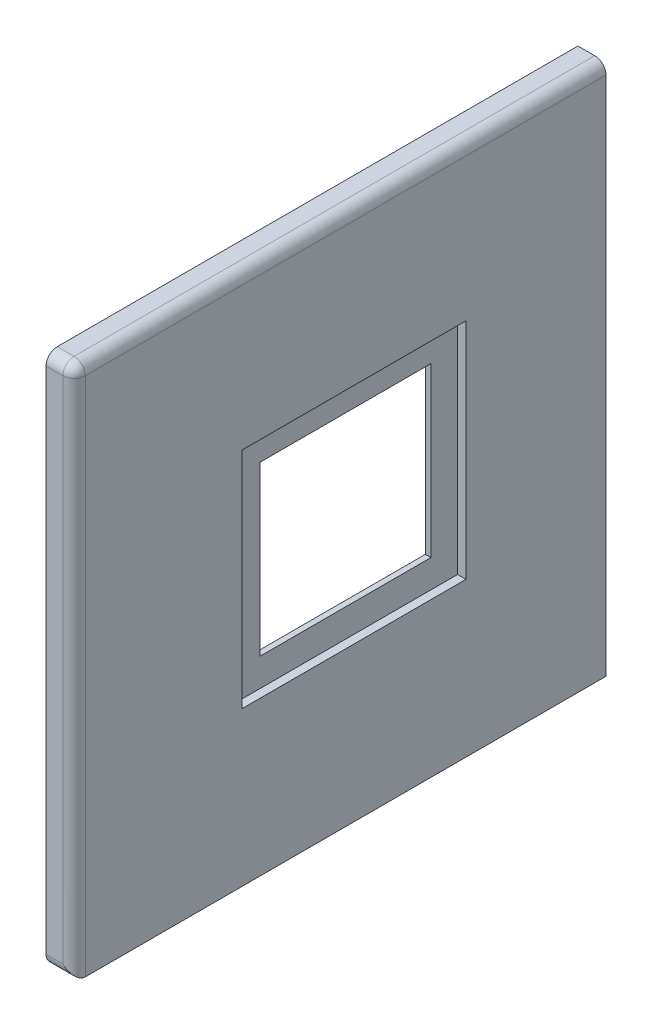
ISO-10303-21;
HEADER;
FILE_DESCRIPTION(('STEP AP214'),'2;1');
FILE_NAME('part.step','',(''),(''),'','','');
FILE_SCHEMA(('AUTOMOTIVE_DESIGN { 1 0 10303 214 1 1 1 1 }'));
ENDSEC;
DATA;
#1=APPLICATION_CONTEXT('core data for automotive mechanical design processes');
#2=APPLICATION_PROTOCOL_DEFINITION('international standard','automotive_design',2000,#1);
#3=PRODUCT_CONTEXT('',#1,'mechanical');
#4=PRODUCT('Part','Part','',(#3));
#5=PRODUCT_RELATED_PRODUCT_CATEGORY('part','',(#4));
#6=PRODUCT_DEFINITION_FORMATION('','',#4);
#7=PRODUCT_DEFINITION_CONTEXT('part definition',#1,'design');
#8=PRODUCT_DEFINITION('design','',#6,#7);
#9=PRODUCT_DEFINITION_SHAPE('','',#8);
#10=(LENGTH_UNIT() NAMED_UNIT(*) SI_UNIT(.MILLI.,.METRE.));
#11=(NAMED_UNIT(*) PLANE_ANGLE_UNIT() SI_UNIT($,.RADIAN.));
#12=(NAMED_UNIT(*) SI_UNIT($,.STERADIAN.) SOLID_ANGLE_UNIT());
#13=UNCERTAINTY_MEASURE_WITH_UNIT(LENGTH_MEASURE(1.E-05),#10,'distance_accuracy_value','');
#14=(GEOMETRIC_REPRESENTATION_CONTEXT(3) GLOBAL_UNCERTAINTY_ASSIGNED_CONTEXT((#13)) GLOBAL_UNIT_ASSIGNED_CONTEXT((#10,
#11,#12)) REPRESENTATION_CONTEXT('',''));
#15=CARTESIAN_POINT('',(0.,0.,0.));
#16=DIRECTION('',(0.,0.,1.));
#17=DIRECTION('',(1.,0.,0.));
#18=AXIS2_PLACEMENT_3D('',#15,#16,#17);
#19=CARTESIAN_POINT('',(5.,36.5,0.));
#20=DIRECTION('',(0.,-1.,0.));
#21=DIRECTION('',(0.,0.,-1.));
#22=AXIS2_PLACEMENT_3D('',#19,#20,#21);
#23=PLANE('',#22);
#24=DIRECTION('',(-1.,0.,0.));
#25=VECTOR('',#24,1.);
#26=CARTESIAN_POINT('',(5.,36.5,36.5));
#27=LINE('',#26,#25);
#28=CARTESIAN_POINT('',(5.,36.5,36.5));
#29=VERTEX_POINT('',#28);
#30=CARTESIAN_POINT('',(2.,36.5,36.5));
#31=VERTEX_POINT('',#30);
#32=EDGE_CURVE('E472',#29,#31,#27,.T.);
#33=ORIENTED_EDGE('',*,*,#32,.T.);
#34=DIRECTION('',(0.,0.,-1.));
#35=VECTOR('',#34,1.);
#36=CARTESIAN_POINT('',(2.,36.5,0.));
#37=LINE('',#36,#35);
#38=CARTESIAN_POINT('',(2.,36.5,25.709845908582));
#39=VERTEX_POINT('',#38);
#40=EDGE_CURVE('E298',#31,#39,#37,.T.);
#41=ORIENTED_EDGE('',*,*,#40,.T.);
#42=DIRECTION('',(-1.,0.,0.));
#43=VECTOR('',#42,1.);
#44=CARTESIAN_POINT('',(5.,36.5,25.709845908582));
#45=LINE('',#44,#43);
#46=CARTESIAN_POINT('',(5.,36.5,25.709845908582));
#47=VERTEX_POINT('',#46);
#48=EDGE_CURVE('E471',#47,#39,#45,.T.);
#49=ORIENTED_EDGE('',*,*,#48,.F.);
#50=DIRECTION('',(0.,0.,1.));
#51=VECTOR('',#50,1.);
#52=CARTESIAN_POINT('',(5.,36.5,0.));
#53=LINE('',#52,#51);
#54=EDGE_CURVE('E439',#47,#29,#53,.T.);
#55=ORIENTED_EDGE('',*,*,#54,.T.);
#56=EDGE_LOOP('',(#33,#41,#49,#55));
#57=FACE_BOUND('',#56,.T.);
#58=ADVANCED_FACE('F41',(#57),#23,.T.);
#59=CARTESIAN_POINT('',(5.,0.,36.5));
#60=DIRECTION('',(0.,0.,-1.));
#61=DIRECTION('',(-1.,0.,0.));
#62=AXIS2_PLACEMENT_3D('',#59,#60,#61);
#63=PLANE('',#62);
#64=DIRECTION('',(-1.,0.,0.));
#65=VECTOR('',#64,1.);
#66=CARTESIAN_POINT('',(5.,-36.5,36.5));
#67=LINE('',#66,#65);
#68=CARTESIAN_POINT('',(5.,-36.5,36.5));
#69=VERTEX_POINT('',#68);
#70=CARTESIAN_POINT('',(2.,-36.5,36.5));
#71=VERTEX_POINT('',#70);
#72=EDGE_CURVE('E477',#69,#71,#67,.T.);
#73=ORIENTED_EDGE('',*,*,#72,.T.);
#74=DIRECTION('',(0.,1.,0.));
#75=VECTOR('',#74,1.);
#76=CARTESIAN_POINT('',(2.,0.,36.5));
#77=LINE('',#76,#75);
#78=EDGE_CURVE('E353',#71,#31,#77,.T.);
#79=ORIENTED_EDGE('',*,*,#78,.T.);
#80=ORIENTED_EDGE('',*,*,#32,.F.);
#81=DIRECTION('',(0.,-1.,0.));
#82=VECTOR('',#81,1.);
#83=CARTESIAN_POINT('',(5.,0.,36.5));
#84=LINE('',#83,#82);
#85=EDGE_CURVE('E468',#29,#69,#84,.T.);
#86=ORIENTED_EDGE('',*,*,#85,.T.);
#87=EDGE_LOOP('',(#73,#79,#80,#86));
#88=FACE_BOUND('',#87,.T.);
#89=ADVANCED_FACE('F623',(#88),#63,.T.);
#90=CARTESIAN_POINT('',(5.,-36.5,0.));
#91=DIRECTION('',(0.,-1.,0.));
#92=DIRECTION('',(0.,0.,-1.));
#93=AXIS2_PLACEMENT_3D('',#90,#91,#92);
#94=PLANE('',#93);
#95=DIRECTION('',(0.,0.,-1.));
#96=VECTOR('',#95,1.);
#97=CARTESIAN_POINT('',(2.,-36.5,0.));
#98=LINE('',#97,#96);
#99=CARTESIAN_POINT('',(2.,-36.5,-36.5));
#100=VERTEX_POINT('',#99);
#101=EDGE_CURVE('E350',#71,#100,#98,.T.);
#102=ORIENTED_EDGE('',*,*,#101,.F.);
#103=ORIENTED_EDGE('',*,*,#72,.F.);
#104=DIRECTION('',(0.,0.,1.));
#105=VECTOR('',#104,1.);
#106=CARTESIAN_POINT('',(5.,-36.5,0.));
#107=LINE('',#106,#105);
#108=CARTESIAN_POINT('',(5.,-36.5,-36.5));
#109=VERTEX_POINT('',#108);
#110=EDGE_CURVE('E464',#109,#69,#107,.T.);
#111=ORIENTED_EDGE('',*,*,#110,.F.);
#112=DIRECTION('',(-1.,0.,0.));
#113=VECTOR('',#112,1.);
#114=CARTESIAN_POINT('',(5.,-36.5,-36.5));
#115=LINE('',#114,#113);
#116=EDGE_CURVE('E481',#109,#100,#115,.T.);
#117=ORIENTED_EDGE('',*,*,#116,.T.);
#118=EDGE_LOOP('',(#102,#103,#111,#117));
#119=FACE_BOUND('',#118,.T.);
#120=ADVANCED_FACE('F629',(#119),#94,.F.);
#121=CARTESIAN_POINT('',(5.,0.,-36.5));
#122=DIRECTION('',(0.,0.,1.));
#123=DIRECTION('',(1.,0.,0.));
#124=AXIS2_PLACEMENT_3D('',#121,#122,#123);
#125=PLANE('',#124);
#126=DIRECTION('',(-1.,0.,0.));
#127=VECTOR('',#126,1.);
#128=CARTESIAN_POINT('',(5.,36.5,-36.5));
#129=LINE('',#128,#127);
#130=CARTESIAN_POINT('',(5.,36.5,-36.5));
#131=VERTEX_POINT('',#130);
#132=CARTESIAN_POINT('',(2.,36.5,-36.5));
#133=VERTEX_POINT('',#132);
#134=EDGE_CURVE('E485',#131,#133,#129,.T.);
#135=ORIENTED_EDGE('',*,*,#134,.T.);
#136=DIRECTION('',(0.,-1.,0.));
#137=VECTOR('',#136,1.);
#138=CARTESIAN_POINT('',(2.,0.,-36.5));
#139=LINE('',#138,#137);
#140=EDGE_CURVE('E346',#133,#100,#139,.T.);
#141=ORIENTED_EDGE('',*,*,#140,.T.);
#142=ORIENTED_EDGE('',*,*,#116,.F.);
#143=DIRECTION('',(0.,1.,0.));
#144=VECTOR('',#143,1.);
#145=CARTESIAN_POINT('',(5.,0.,-36.5));
#146=LINE('',#145,#144);
#147=EDGE_CURVE('E461',#109,#131,#146,.T.);
#148=ORIENTED_EDGE('',*,*,#147,.T.);
#149=EDGE_LOOP('',(#135,#141,#142,#148));
#150=FACE_BOUND('',#149,.T.);
#151=ADVANCED_FACE('F720',(#150),#125,.T.);
#152=CARTESIAN_POINT('',(5.,36.5,0.));
#153=DIRECTION('',(0.,-1.,0.));
#154=DIRECTION('',(0.,0.,-1.));
#155=AXIS2_PLACEMENT_3D('',#152,#153,#154);
#156=PLANE('',#155);
#157=DIRECTION('',(-1.,0.,0.));
#158=VECTOR('',#157,1.);
#159=CARTESIAN_POINT('',(5.,36.5,-25.709845908582));
#160=LINE('',#159,#158);
#161=CARTESIAN_POINT('',(5.,36.5,-25.709845908582));
#162=VERTEX_POINT('',#161);
#163=CARTESIAN_POINT('',(2.,36.5,-25.709845908582));
#164=VERTEX_POINT('',#163);
#165=EDGE_CURVE('E489',#162,#164,#160,.T.);
#166=ORIENTED_EDGE('',*,*,#165,.T.);
#167=DIRECTION('',(0.,0.,-1.));
#168=VECTOR('',#167,1.);
#169=CARTESIAN_POINT('',(2.,36.5,0.));
#170=LINE('',#169,#168);
#171=EDGE_CURVE('E342',#164,#133,#170,.T.);
#172=ORIENTED_EDGE('',*,*,#171,.T.);
#173=ORIENTED_EDGE('',*,*,#134,.F.);
#174=DIRECTION('',(0.,0.,1.));
#175=VECTOR('',#174,1.);
#176=CARTESIAN_POINT('',(5.,36.5,0.));
#177=LINE('',#176,#175);
#178=EDGE_CURVE('E458',#131,#162,#177,.T.);
#179=ORIENTED_EDGE('',*,*,#178,.T.);
#180=EDGE_LOOP('',(#166,#172,#173,#179));
#181=FACE_BOUND('',#180,.T.);
#182=ADVANCED_FACE('F724',(#181),#156,.T.);
#183=CARTESIAN_POINT('',(5.,40.0650205887948,-17.589521234105));
#184=DIRECTION('',(0.,-0.915644030191284,0.401990062035198));
#185=DIRECTION('',(0.,-0.401990062035198,-0.915644030191284));
#186=AXIS2_PLACEMENT_3D('',#183,#184,#185);
#187=PLANE('',#186);
#188=DIRECTION('',(1.,0.,0.));
#189=VECTOR('',#188,1.);
#190=CARTESIAN_POINT('',(7.,45.,-6.3487347974709));
#191=LINE('',#190,#189);
#192=CARTESIAN_POINT('',(2.,45.,-6.34873479747088));
#193=VERTEX_POINT('',#192);
#194=CARTESIAN_POINT('',(5.,45.,-6.3487347974709));
#195=VERTEX_POINT('',#194);
#196=EDGE_CURVE('E67',#193,#195,#191,.T.);
#197=ORIENTED_EDGE('',*,*,#196,.F.);
#198=DIRECTION('',(0.,-0.401990062035198,-0.915644030191284));
#199=VECTOR('',#198,1.);
#200=CARTESIAN_POINT('',(2.,40.0650205887948,-17.589521234105));
#201=LINE('',#200,#199);
#202=EDGE_CURVE('E338',#193,#164,#201,.T.);
#203=ORIENTED_EDGE('',*,*,#202,.T.);
#204=ORIENTED_EDGE('',*,*,#165,.F.);
#205=DIRECTION('',(0.,0.401990062035198,0.915644030191284));
#206=VECTOR('',#205,1.);
#207=CARTESIAN_POINT('',(5.,40.0650205887948,-17.589521234105));
#208=LINE('',#207,#206);
#209=EDGE_CURVE('E454',#162,#195,#208,.T.);
#210=ORIENTED_EDGE('',*,*,#209,.T.);
#211=EDGE_LOOP('',(#197,#203,#204,#210));
#212=FACE_BOUND('',#211,.T.);
#213=ADVANCED_FACE('F713',(#212),#187,.T.);
#214=CARTESIAN_POINT('',(10.,30.,-30.5107562106538));
#215=DIRECTION('',(0.,0.,-1.));
#216=DIRECTION('',(0.,1.,0.));
#217=AXIS2_PLACEMENT_3D('',#214,#215,#216);
#218=PLANE('',#217);
#219=DIRECTION('',(0.,-1.,0.));
#220=VECTOR('',#219,1.);
#221=CARTESIAN_POINT('',(7.,30.,-30.5107562106538));
#222=LINE('',#221,#220);
#223=CARTESIAN_POINT('',(7.,30.,-30.5107562106538));
#224=VERTEX_POINT('',#223);
#225=CARTESIAN_POINT('',(7.,-30.,-30.5107562106538));
#226=VERTEX_POINT('',#225);
#227=EDGE_CURVE('E416',#224,#226,#222,.T.);
#228=ORIENTED_EDGE('',*,*,#227,.F.);
#229=DIRECTION('',(-1.,0.,0.));
#230=VECTOR('',#229,1.);
#231=CARTESIAN_POINT('',(10.,30.,-30.5107562106538));
#232=LINE('',#231,#230);
#233=CARTESIAN_POINT('',(5.,30.,-30.5107562106538));
#234=VERTEX_POINT('',#233);
#235=EDGE_CURVE('E436',#224,#234,#232,.T.);
#236=ORIENTED_EDGE('',*,*,#235,.T.);
#237=DIRECTION('',(0.,-1.,0.));
#238=VECTOR('',#237,1.);
#239=CARTESIAN_POINT('',(5.,30.,-30.5107562106538));
#240=LINE('',#239,#238);
#241=CARTESIAN_POINT('',(5.,-30.,-30.5107562106538));
#242=VERTEX_POINT('',#241);
#243=EDGE_CURVE('E419',#234,#242,#240,.T.);
#244=ORIENTED_EDGE('',*,*,#243,.T.);
#245=DIRECTION('',(-1.,0.,0.));
#246=VECTOR('',#245,1.);
#247=CARTESIAN_POINT('',(10.,-30.,-30.5107562106538));
#248=LINE('',#247,#246);
#249=EDGE_CURVE('E435',#226,#242,#248,.T.);
#250=ORIENTED_EDGE('',*,*,#249,.F.);
#251=EDGE_LOOP('',(#228,#236,#244,#250));
#252=FACE_BOUND('',#251,.T.);
#253=ADVANCED_FACE('F706',(#252),#218,.F.);
#254=CARTESIAN_POINT('',(10.,30.,-30.5107562106538));
#255=DIRECTION('',(0.,1.,0.));
#256=DIRECTION('',(0.,0.,1.));
#257=AXIS2_PLACEMENT_3D('',#254,#255,#256);
#258=PLANE('',#257);
#259=DIRECTION('',(0.,0.,-1.));
#260=VECTOR('',#259,1.);
#261=CARTESIAN_POINT('',(7.,30.,-30.5107562106538));
#262=LINE('',#261,#260);
#263=CARTESIAN_POINT('',(7.,30.,30.5107562106538));
#264=VERTEX_POINT('',#263);
#265=EDGE_CURVE('E413',#264,#224,#262,.T.);
#266=ORIENTED_EDGE('',*,*,#265,.F.);
#267=DIRECTION('',(-1.,0.,0.));
#268=VECTOR('',#267,1.);
#269=CARTESIAN_POINT('',(10.,30.,30.5107562106538));
#270=LINE('',#269,#268);
#271=CARTESIAN_POINT('',(5.,30.,30.5107562106538));
#272=VERTEX_POINT('',#271);
#273=EDGE_CURVE('E440',#264,#272,#270,.T.);
#274=ORIENTED_EDGE('',*,*,#273,.T.);
#275=DIRECTION('',(0.,0.,-1.));
#276=VECTOR('',#275,1.);
#277=CARTESIAN_POINT('',(5.,30.,-30.5107562106538));
#278=LINE('',#277,#276);
#279=EDGE_CURVE('E431',#272,#234,#278,.T.);
#280=ORIENTED_EDGE('',*,*,#279,.T.);
#281=ORIENTED_EDGE('',*,*,#235,.F.);
#282=EDGE_LOOP('',(#266,#274,#280,#281));
#283=FACE_BOUND('',#282,.T.);
#284=ADVANCED_FACE('F703',(#283),#258,.F.);
#285=CARTESIAN_POINT('',(10.,30.,30.5107562106538));
#286=DIRECTION('',(0.,0.,1.));
#287=DIRECTION('',(0.,-1.,0.));
#288=AXIS2_PLACEMENT_3D('',#285,#286,#287);
#289=PLANE('',#288);
#290=DIRECTION('',(0.,1.,0.));
#291=VECTOR('',#290,1.);
#292=CARTESIAN_POINT('',(7.,30.,30.5107562106538));
#293=LINE('',#292,#291);
#294=CARTESIAN_POINT('',(7.,-30.,30.5107562106538));
#295=VERTEX_POINT('',#294);
#296=EDGE_CURVE('E401',#295,#264,#293,.T.);
#297=ORIENTED_EDGE('',*,*,#296,.F.);
#298=DIRECTION('',(-1.,0.,0.));
#299=VECTOR('',#298,1.);
#300=CARTESIAN_POINT('',(10.,-30.,30.5107562106538));
#301=LINE('',#300,#299);
#302=CARTESIAN_POINT('',(5.,-30.,30.5107562106538));
#303=VERTEX_POINT('',#302);
#304=EDGE_CURVE('E443',#295,#303,#301,.T.);
#305=ORIENTED_EDGE('',*,*,#304,.T.);
#306=DIRECTION('',(0.,1.,0.));
#307=VECTOR('',#306,1.);
#308=CARTESIAN_POINT('',(5.,30.,30.5107562106538));
#309=LINE('',#308,#307);
#310=EDGE_CURVE('E427',#303,#272,#309,.T.);
#311=ORIENTED_EDGE('',*,*,#310,.T.);
#312=ORIENTED_EDGE('',*,*,#273,.F.);
#313=EDGE_LOOP('',(#297,#305,#311,#312));
#314=FACE_BOUND('',#313,.T.);
#315=ADVANCED_FACE('F642',(#314),#289,.F.);
#316=CARTESIAN_POINT('',(10.,-30.,-30.5107562106538));
#317=DIRECTION('',(0.,-1.,0.));
#318=DIRECTION('',(0.,0.,-1.));
#319=AXIS2_PLACEMENT_3D('',#316,#317,#318);
#320=PLANE('',#319);
#321=DIRECTION('',(0.,0.,1.));
#322=VECTOR('',#321,1.);
#323=CARTESIAN_POINT('',(7.,-30.,-30.5107562106538));
#324=LINE('',#323,#322);
#325=EDGE_CURVE('E524',#226,#295,#324,.T.);
#326=ORIENTED_EDGE('',*,*,#325,.F.);
#327=ORIENTED_EDGE('',*,*,#249,.T.);
#328=DIRECTION('',(0.,0.,1.));
#329=VECTOR('',#328,1.);
#330=CARTESIAN_POINT('',(5.,-30.,-30.5107562106538));
#331=LINE('',#330,#329);
#332=EDGE_CURVE('E423',#242,#303,#331,.T.);
#333=ORIENTED_EDGE('',*,*,#332,.T.);
#334=ORIENTED_EDGE('',*,*,#304,.F.);
#335=EDGE_LOOP('',(#326,#327,#333,#334));
#336=FACE_BOUND('',#335,.T.);
#337=ADVANCED_FACE('F635',(#336),#320,.F.);
#338=CARTESIAN_POINT('',(0.,0.,0.));
#339=DIRECTION('',(1.,0.,0.));
#340=DIRECTION('',(0.,0.,-1.));
#341=AXIS2_PLACEMENT_3D('',#338,#339,#340);
#342=PLANE('',#341);
#343=DIRECTION('',(0.,0.,1.));
#344=VECTOR('',#343,1.);
#345=CARTESIAN_POINT('',(0.,90.,100.));
#346=LINE('',#345,#344);
#347=CARTESIAN_POINT('',(0.,90.,-85.));
#348=VERTEX_POINT('',#347);
#349=CARTESIAN_POINT('',(0.,90.,95.));
#350=VERTEX_POINT('',#349);
#351=EDGE_CURVE('E302',#348,#350,#346,.T.);
#352=ORIENTED_EDGE('',*,*,#351,.T.);
#353=DIRECTION('',(0.,-1.,0.));
#354=VECTOR('',#353,1.);
#355=CARTESIAN_POINT('',(0.,95.,95.));
#356=LINE('',#355,#354);
#357=CARTESIAN_POINT('',(0.,-90.,95.));
#358=VERTEX_POINT('',#357);
#359=EDGE_CURVE('E318',#350,#358,#356,.T.);
#360=ORIENTED_EDGE('',*,*,#359,.T.);
#361=DIRECTION('',(0.,0.,-1.));
#362=VECTOR('',#361,1.);
#363=CARTESIAN_POINT('',(0.,-90.,100.));
#364=LINE('',#363,#362);
#365=CARTESIAN_POINT('',(0.,-90.,-85.));
#366=VERTEX_POINT('',#365);
#367=EDGE_CURVE('E322',#358,#366,#364,.T.);
#368=ORIENTED_EDGE('',*,*,#367,.T.);
#369=DIRECTION('',(0.,1.,0.));
#370=VECTOR('',#369,1.);
#371=CARTESIAN_POINT('',(0.,95.,-85.));
#372=LINE('',#371,#370);
#373=EDGE_CURVE('E59',#366,#348,#372,.T.);
#374=ORIENTED_EDGE('',*,*,#373,.T.);
#375=EDGE_LOOP('',(#352,#360,#368,#374));
#376=FACE_BOUND('',#375,.T.);
#377=DIRECTION('',(0.,-1.,0.));
#378=VECTOR('',#377,1.);
#379=CARTESIAN_POINT('',(0.,95.,100.));
#380=LINE('',#379,#378);
#381=CARTESIAN_POINT('',(0.,91.,100.));
#382=VERTEX_POINT('',#381);
#383=CARTESIAN_POINT('',(0.,-91.,100.));
#384=VERTEX_POINT('',#383);
#385=EDGE_CURVE('E476',#382,#384,#380,.T.);
#386=ORIENTED_EDGE('',*,*,#385,.F.);
#387=CARTESIAN_POINT('',(0.,91.,96.));
#388=DIRECTION('',(1.,0.,0.));
#389=DIRECTION('',(0.,0.,-1.));
#390=AXIS2_PLACEMENT_3D('',#387,#388,#389);
#391=CIRCLE('',#390,4.);
#392=CARTESIAN_POINT('',(0.,95.,96.));
#393=VERTEX_POINT('',#392);
#394=EDGE_CURVE('E540',#382,#393,#391,.F.);
#395=ORIENTED_EDGE('',*,*,#394,.T.);
#396=DIRECTION('',(0.,0.,1.));
#397=VECTOR('',#396,1.);
#398=CARTESIAN_POINT('',(0.,95.,100.));
#399=LINE('',#398,#397);
#400=CARTESIAN_POINT('',(0.,95.,-90.));
#401=VERTEX_POINT('',#400);
#402=EDGE_CURVE('E500',#401,#393,#399,.T.);
#403=ORIENTED_EDGE('',*,*,#402,.F.);
#404=DIRECTION('',(0.,1.,0.));
#405=VECTOR('',#404,1.);
#406=CARTESIAN_POINT('',(0.,95.,-90.));
#407=LINE('',#406,#405);
#408=CARTESIAN_POINT('',(0.,-95.,-90.));
#409=VERTEX_POINT('',#408);
#410=EDGE_CURVE('E511',#409,#401,#407,.T.);
#411=ORIENTED_EDGE('',*,*,#410,.F.);
#412=DIRECTION('',(0.,0.,-1.));
#413=VECTOR('',#412,1.);
#414=CARTESIAN_POINT('',(0.,-95.,100.));
#415=LINE('',#414,#413);
#416=CARTESIAN_POINT('',(0.,-95.,96.));
#417=VERTEX_POINT('',#416);
#418=EDGE_CURVE('E508',#417,#409,#415,.T.);
#419=ORIENTED_EDGE('',*,*,#418,.F.);
#420=CARTESIAN_POINT('',(0.,-91.,96.));
#421=DIRECTION('',(1.,0.,0.));
#422=DIRECTION('',(0.,0.,-1.));
#423=AXIS2_PLACEMENT_3D('',#420,#421,#422);
#424=CIRCLE('',#423,4.);
#425=EDGE_CURVE('E537',#417,#384,#424,.F.);
#426=ORIENTED_EDGE('',*,*,#425,.T.);
#427=EDGE_LOOP('',(#386,#395,#403,#411,#419,#426));
#428=FACE_BOUND('',#427,.T.);
#429=ADVANCED_FACE('F589',(#376,#428),#342,.F.);
#430=CARTESIAN_POINT('',(10.,95.,100.));
#431=DIRECTION('',(0.,0.,-1.));
#432=DIRECTION('',(-1.,0.,0.));
#433=AXIS2_PLACEMENT_3D('',#430,#431,#432);
#434=PLANE('',#433);
#435=DIRECTION('',(0.,-1.,0.));
#436=VECTOR('',#435,1.);
#437=CARTESIAN_POINT('',(6.,95.,100.));
#438=LINE('',#437,#436);
#439=CARTESIAN_POINT('',(6.,-91.,100.));
#440=VERTEX_POINT('',#439);
#441=CARTESIAN_POINT('',(6.,91.,100.));
#442=VERTEX_POINT('',#441);
#443=EDGE_CURVE('E527',#440,#442,#438,.F.);
#444=ORIENTED_EDGE('',*,*,#443,.T.);
#445=DIRECTION('',(-1.,0.,0.));
#446=VECTOR('',#445,1.);
#447=CARTESIAN_POINT('',(10.,91.,100.));
#448=LINE('',#447,#446);
#449=EDGE_CURVE('E533',#442,#382,#448,.T.);
#450=ORIENTED_EDGE('',*,*,#449,.T.);
#451=ORIENTED_EDGE('',*,*,#385,.T.);
#452=DIRECTION('',(-1.,0.,0.));
#453=VECTOR('',#452,1.);
#454=CARTESIAN_POINT('',(10.,-91.,100.));
#455=LINE('',#454,#453);
#456=EDGE_CURVE('E530',#384,#440,#455,.F.);
#457=ORIENTED_EDGE('',*,*,#456,.T.);
#458=EDGE_LOOP('',(#444,#450,#451,#457));
#459=FACE_BOUND('',#458,.T.);
#460=ADVANCED_FACE('F608',(#459),#434,.F.);
#461=CARTESIAN_POINT('',(10.,-95.,100.));
#462=DIRECTION('',(0.,1.,0.));
#463=DIRECTION('',(0.,0.,1.));
#464=AXIS2_PLACEMENT_3D('',#461,#462,#463);
#465=PLANE('',#464);
#466=DIRECTION('',(0.,0.,-1.));
#467=VECTOR('',#466,1.);
#468=CARTESIAN_POINT('',(10.,-95.,100.));
#469=LINE('',#468,#467);
#470=CARTESIAN_POINT('',(10.,-95.,96.));
#471=VERTEX_POINT('',#470);
#472=CARTESIAN_POINT('',(10.,-95.,-90.));
#473=VERTEX_POINT('',#472);
#474=EDGE_CURVE('E496',#471,#473,#469,.T.);
#475=ORIENTED_EDGE('',*,*,#474,.F.);
#476=DIRECTION('',(-1.,0.,0.));
#477=VECTOR('',#476,1.);
#478=CARTESIAN_POINT('',(10.,-95.,96.));
#479=LINE('',#478,#477);
#480=EDGE_CURVE('E549',#471,#417,#479,.T.);
#481=ORIENTED_EDGE('',*,*,#480,.T.);
#482=ORIENTED_EDGE('',*,*,#418,.T.);
#483=DIRECTION('',(-1.,0.,0.));
#484=VECTOR('',#483,1.);
#485=CARTESIAN_POINT('',(10.,-95.,-90.));
#486=LINE('',#485,#484);
#487=EDGE_CURVE('E520',#473,#409,#486,.T.);
#488=ORIENTED_EDGE('',*,*,#487,.F.);
#489=EDGE_LOOP('',(#475,#481,#482,#488));
#490=FACE_BOUND('',#489,.T.);
#491=ADVANCED_FACE('F584',(#490),#465,.F.);
#492=CARTESIAN_POINT('',(10.,95.,-90.));
#493=DIRECTION('',(0.,0.,1.));
#494=DIRECTION('',(1.,0.,0.));
#495=AXIS2_PLACEMENT_3D('',#492,#493,#494);
#496=PLANE('',#495);
#497=DIRECTION('',(-1.,0.,0.));
#498=VECTOR('',#497,1.);
#499=CARTESIAN_POINT('',(10.,95.,-90.));
#500=LINE('',#499,#498);
#501=CARTESIAN_POINT('',(6.,95.,-90.));
#502=VERTEX_POINT('',#501);
#503=EDGE_CURVE('E504',#502,#401,#500,.T.);
#504=ORIENTED_EDGE('',*,*,#503,.F.);
#505=CARTESIAN_POINT('',(6.,91.,-90.));
#506=DIRECTION('',(0.,0.,1.));
#507=DIRECTION('',(1.,0.,0.));
#508=AXIS2_PLACEMENT_3D('',#505,#506,#507);
#509=CIRCLE('',#508,4.);
#510=CARTESIAN_POINT('',(10.,91.,-90.));
#511=VERTEX_POINT('',#510);
#512=EDGE_CURVE('E11',#502,#511,#509,.F.);
#513=ORIENTED_EDGE('',*,*,#512,.T.);
#514=DIRECTION('',(0.,1.,0.));
#515=VECTOR('',#514,1.);
#516=CARTESIAN_POINT('',(10.,95.,-90.));
#517=LINE('',#516,#515);
#518=EDGE_CURVE('E499',#473,#511,#517,.T.);
#519=ORIENTED_EDGE('',*,*,#518,.F.);
#520=ORIENTED_EDGE('',*,*,#487,.T.);
#521=ORIENTED_EDGE('',*,*,#410,.T.);
#522=EDGE_LOOP('',(#504,#513,#519,#520,#521));
#523=FACE_BOUND('',#522,.T.);
#524=ADVANCED_FACE('F593',(#523),#496,.F.);
#525=CARTESIAN_POINT('',(10.,95.,100.));
#526=DIRECTION('',(0.,-1.,0.));
#527=DIRECTION('',(0.,0.,-1.));
#528=AXIS2_PLACEMENT_3D('',#525,#526,#527);
#529=PLANE('',#528);
#530=ORIENTED_EDGE('',*,*,#402,.T.);
#531=DIRECTION('',(-1.,0.,0.));
#532=VECTOR('',#531,1.);
#533=CARTESIAN_POINT('',(10.,95.,96.));
#534=LINE('',#533,#532);
#535=CARTESIAN_POINT('',(6.,95.,96.));
#536=VERTEX_POINT('',#535);
#537=EDGE_CURVE('E546',#393,#536,#534,.F.);
#538=ORIENTED_EDGE('',*,*,#537,.T.);
#539=DIRECTION('',(0.,0.,1.));
#540=VECTOR('',#539,1.);
#541=CARTESIAN_POINT('',(6.,95.,-90.));
#542=LINE('',#541,#540);
#543=EDGE_CURVE('E543',#536,#502,#542,.F.);
#544=ORIENTED_EDGE('',*,*,#543,.T.);
#545=ORIENTED_EDGE('',*,*,#503,.T.);
#546=EDGE_LOOP('',(#530,#538,#544,#545));
#547=FACE_BOUND('',#546,.T.);
#548=ADVANCED_FACE('F610',(#547),#529,.F.);
#549=CARTESIAN_POINT('',(10.,0.,0.));
#550=DIRECTION('',(1.,0.,0.));
#551=DIRECTION('',(0.,0.,-1.));
#552=AXIS2_PLACEMENT_3D('',#549,#550,#551);
#553=PLANE('',#552);
#554=DIRECTION('',(0.,-1.,0.));
#555=VECTOR('',#554,1.);
#556=CARTESIAN_POINT('',(10.,40.,40.));
#557=LINE('',#556,#555);
#558=CARTESIAN_POINT('',(10.,40.,40.));
#559=VERTEX_POINT('',#558);
#560=CARTESIAN_POINT('',(10.,-40.,40.));
#561=VERTEX_POINT('',#560);
#562=EDGE_CURVE('E384',#559,#561,#557,.T.);
#563=ORIENTED_EDGE('',*,*,#562,.F.);
#564=DIRECTION('',(0.,0.,1.));
#565=VECTOR('',#564,1.);
#566=CARTESIAN_POINT('',(10.,40.,40.));
#567=LINE('',#566,#565);
#568=CARTESIAN_POINT('',(10.,40.,-40.));
#569=VERTEX_POINT('',#568);
#570=EDGE_CURVE('E371',#569,#559,#567,.T.);
#571=ORIENTED_EDGE('',*,*,#570,.F.);
#572=DIRECTION('',(0.,1.,0.));
#573=VECTOR('',#572,1.);
#574=CARTESIAN_POINT('',(10.,40.,-40.));
#575=LINE('',#574,#573);
#576=CARTESIAN_POINT('',(10.,-40.,-40.));
#577=VERTEX_POINT('',#576);
#578=EDGE_CURVE('E391',#577,#569,#575,.T.);
#579=ORIENTED_EDGE('',*,*,#578,.F.);
#580=DIRECTION('',(0.,0.,-1.));
#581=VECTOR('',#580,1.);
#582=CARTESIAN_POINT('',(10.,-40.,40.));
#583=LINE('',#582,#581);
#584=EDGE_CURVE('E387',#561,#577,#583,.T.);
#585=ORIENTED_EDGE('',*,*,#584,.F.);
#586=EDGE_LOOP('',(#563,#571,#579,#585));
#587=FACE_BOUND('',#586,.T.);
#588=ORIENTED_EDGE('',*,*,#518,.T.);
#589=DIRECTION('',(0.,0.,1.));
#590=VECTOR('',#589,1.);
#591=CARTESIAN_POINT('',(10.,91.,100.));
#592=LINE('',#591,#590);
#593=CARTESIAN_POINT('',(10.,91.,96.));
#594=VERTEX_POINT('',#593);
#595=EDGE_CURVE('E51',#511,#594,#592,.T.);
#596=ORIENTED_EDGE('',*,*,#595,.T.);
#597=DIRECTION('',(0.,-1.,0.));
#598=VECTOR('',#597,1.);
#599=CARTESIAN_POINT('',(10.,-95.,96.));
#600=LINE('',#599,#598);
#601=EDGE_CURVE('E552',#594,#471,#600,.T.);
#602=ORIENTED_EDGE('',*,*,#601,.T.);
#603=ORIENTED_EDGE('',*,*,#474,.T.);
#604=EDGE_LOOP('',(#588,#596,#602,#603));
#605=FACE_BOUND('',#604,.T.);
#606=ADVANCED_FACE('F598',(#587,#605),#553,.T.);
#607=CARTESIAN_POINT('',(5.,40.0650205887948,17.5895212341051));
#608=DIRECTION('',(0.,-0.915644030191284,-0.401990062035199));
#609=DIRECTION('',(0.,0.401990062035199,-0.915644030191284));
#610=AXIS2_PLACEMENT_3D('',#607,#608,#609);
#611=PLANE('',#610);
#612=DIRECTION('',(-1.,0.,0.));
#613=VECTOR('',#612,1.);
#614=CARTESIAN_POINT('',(7.,45.,6.34873479747096));
#615=LINE('',#614,#613);
#616=CARTESIAN_POINT('',(5.,45.,6.34873479747096));
#617=VERTEX_POINT('',#616);
#618=CARTESIAN_POINT('',(2.,45.,6.34873479747094));
#619=VERTEX_POINT('',#618);
#620=EDGE_CURVE('E360',#617,#619,#615,.T.);
#621=ORIENTED_EDGE('',*,*,#620,.F.);
#622=DIRECTION('',(0.,-0.401990062035199,0.915644030191284));
#623=VECTOR('',#622,1.);
#624=CARTESIAN_POINT('',(5.,40.0650205887948,17.5895212341051));
#625=LINE('',#624,#623);
#626=EDGE_CURVE('E451',#617,#47,#625,.T.);
#627=ORIENTED_EDGE('',*,*,#626,.T.);
#628=ORIENTED_EDGE('',*,*,#48,.T.);
#629=DIRECTION('',(0.,0.401990062035199,-0.915644030191284));
#630=VECTOR('',#629,1.);
#631=CARTESIAN_POINT('',(2.,40.0650205887948,17.5895212341051));
#632=LINE('',#631,#630);
#633=EDGE_CURVE('E334',#39,#619,#632,.T.);
#634=ORIENTED_EDGE('',*,*,#633,.T.);
#635=EDGE_LOOP('',(#621,#627,#628,#634));
#636=FACE_BOUND('',#635,.T.);
#637=ADVANCED_FACE('F617',(#636),#611,.T.);
#638=CARTESIAN_POINT('',(5.,0.,0.));
#639=DIRECTION('',(-1.,0.,0.));
#640=DIRECTION('',(0.,0.,1.));
#641=AXIS2_PLACEMENT_3D('',#638,#639,#640);
#642=PLANE('',#641);
#643=DIRECTION('',(0.,0.,1.));
#644=VECTOR('',#643,1.);
#645=CARTESIAN_POINT('',(5.,45.,40.));
#646=LINE('',#645,#644);
#647=EDGE_CURVE('E357',#195,#617,#646,.T.);
#648=ORIENTED_EDGE('',*,*,#647,.F.);
#649=ORIENTED_EDGE('',*,*,#209,.F.);
#650=ORIENTED_EDGE('',*,*,#178,.F.);
#651=ORIENTED_EDGE('',*,*,#147,.F.);
#652=ORIENTED_EDGE('',*,*,#110,.T.);
#653=ORIENTED_EDGE('',*,*,#85,.F.);
#654=ORIENTED_EDGE('',*,*,#54,.F.);
#655=ORIENTED_EDGE('',*,*,#626,.F.);
#656=EDGE_LOOP('',(#648,#649,#650,#651,#652,#653,#654,#655));
#657=FACE_BOUND('',#656,.T.);
#658=ORIENTED_EDGE('',*,*,#243,.F.);
#659=ORIENTED_EDGE('',*,*,#279,.F.);
#660=ORIENTED_EDGE('',*,*,#310,.F.);
#661=ORIENTED_EDGE('',*,*,#332,.F.);
#662=EDGE_LOOP('',(#658,#659,#660,#661));
#663=FACE_BOUND('',#662,.T.);
#664=ADVANCED_FACE('F686',(#657,#663),#642,.T.);
#665=CARTESIAN_POINT('',(7.,0.,0.));
#666=DIRECTION('',(1.,0.,0.));
#667=DIRECTION('',(0.,0.,-1.));
#668=AXIS2_PLACEMENT_3D('',#665,#666,#667);
#669=PLANE('',#668);
#670=DIRECTION('',(0.,-1.,0.));
#671=VECTOR('',#670,1.);
#672=CARTESIAN_POINT('',(7.,40.,40.));
#673=LINE('',#672,#671);
#674=CARTESIAN_POINT('',(7.,40.,40.));
#675=VERTEX_POINT('',#674);
#676=CARTESIAN_POINT('',(7.,-40.,40.));
#677=VERTEX_POINT('',#676);
#678=EDGE_CURVE('E366',#675,#677,#673,.T.);
#679=ORIENTED_EDGE('',*,*,#678,.T.);
#680=DIRECTION('',(0.,0.,-1.));
#681=VECTOR('',#680,1.);
#682=CARTESIAN_POINT('',(7.,-40.,40.));
#683=LINE('',#682,#681);
#684=CARTESIAN_POINT('',(7.,-40.,-40.));
#685=VERTEX_POINT('',#684);
#686=EDGE_CURVE('E370',#677,#685,#683,.T.);
#687=ORIENTED_EDGE('',*,*,#686,.T.);
#688=DIRECTION('',(0.,1.,0.));
#689=VECTOR('',#688,1.);
#690=CARTESIAN_POINT('',(7.,40.,-40.));
#691=LINE('',#690,#689);
#692=CARTESIAN_POINT('',(7.,40.,-40.));
#693=VERTEX_POINT('',#692);
#694=EDGE_CURVE('E375',#685,#693,#691,.T.);
#695=ORIENTED_EDGE('',*,*,#694,.T.);
#696=DIRECTION('',(0.,0.,1.));
#697=VECTOR('',#696,1.);
#698=CARTESIAN_POINT('',(7.,40.,40.));
#699=LINE('',#698,#697);
#700=EDGE_CURVE('E379',#693,#675,#699,.T.);
#701=ORIENTED_EDGE('',*,*,#700,.T.);
#702=EDGE_LOOP('',(#679,#687,#695,#701));
#703=FACE_BOUND('',#702,.T.);
#704=ORIENTED_EDGE('',*,*,#227,.T.);
#705=ORIENTED_EDGE('',*,*,#325,.T.);
#706=ORIENTED_EDGE('',*,*,#296,.T.);
#707=ORIENTED_EDGE('',*,*,#265,.T.);
#708=EDGE_LOOP('',(#704,#705,#706,#707));
#709=FACE_BOUND('',#708,.T.);
#710=ADVANCED_FACE('F682',(#703,#709),#669,.T.);
#711=CARTESIAN_POINT('',(7.,40.,40.));
#712=DIRECTION('',(0.,0.,1.));
#713=DIRECTION('',(0.,-1.,0.));
#714=AXIS2_PLACEMENT_3D('',#711,#712,#713);
#715=PLANE('',#714);
#716=ORIENTED_EDGE('',*,*,#562,.T.);
#717=DIRECTION('',(1.,0.,0.));
#718=VECTOR('',#717,1.);
#719=CARTESIAN_POINT('',(7.,-40.,40.));
#720=LINE('',#719,#718);
#721=EDGE_CURVE('E383',#677,#561,#720,.T.);
#722=ORIENTED_EDGE('',*,*,#721,.F.);
#723=ORIENTED_EDGE('',*,*,#678,.F.);
#724=DIRECTION('',(1.,0.,0.));
#725=VECTOR('',#724,1.);
#726=CARTESIAN_POINT('',(7.,40.,40.));
#727=LINE('',#726,#725);
#728=EDGE_CURVE('E398',#675,#559,#727,.T.);
#729=ORIENTED_EDGE('',*,*,#728,.T.);
#730=EDGE_LOOP('',(#716,#722,#723,#729));
#731=FACE_BOUND('',#730,.T.);
#732=ADVANCED_FACE('F685',(#731),#715,.F.);
#733=CARTESIAN_POINT('',(7.,40.,40.));
#734=DIRECTION('',(0.,1.,0.));
#735=DIRECTION('',(0.,0.,1.));
#736=AXIS2_PLACEMENT_3D('',#733,#734,#735);
#737=PLANE('',#736);
#738=ORIENTED_EDGE('',*,*,#570,.T.);
#739=ORIENTED_EDGE('',*,*,#728,.F.);
#740=ORIENTED_EDGE('',*,*,#700,.F.);
#741=DIRECTION('',(1.,0.,0.));
#742=VECTOR('',#741,1.);
#743=CARTESIAN_POINT('',(7.,40.,-40.));
#744=LINE('',#743,#742);
#745=EDGE_CURVE('E402',#693,#569,#744,.T.);
#746=ORIENTED_EDGE('',*,*,#745,.T.);
#747=EDGE_LOOP('',(#738,#739,#740,#746));
#748=FACE_BOUND('',#747,.T.);
#749=ADVANCED_FACE('F688',(#748),#737,.F.);
#750=CARTESIAN_POINT('',(7.,40.,-40.));
#751=DIRECTION('',(0.,0.,-1.));
#752=DIRECTION('',(0.,1.,0.));
#753=AXIS2_PLACEMENT_3D('',#750,#751,#752);
#754=PLANE('',#753);
#755=ORIENTED_EDGE('',*,*,#578,.T.);
#756=ORIENTED_EDGE('',*,*,#745,.F.);
#757=ORIENTED_EDGE('',*,*,#694,.F.);
#758=DIRECTION('',(1.,0.,0.));
#759=VECTOR('',#758,1.);
#760=CARTESIAN_POINT('',(7.,-40.,-40.));
#761=LINE('',#760,#759);
#762=EDGE_CURVE('E405',#685,#577,#761,.T.);
#763=ORIENTED_EDGE('',*,*,#762,.T.);
#764=EDGE_LOOP('',(#755,#756,#757,#763));
#765=FACE_BOUND('',#764,.T.);
#766=ADVANCED_FACE('F691',(#765),#754,.F.);
#767=CARTESIAN_POINT('',(7.,-40.,40.));
#768=DIRECTION('',(0.,-1.,0.));
#769=DIRECTION('',(0.,0.,-1.));
#770=AXIS2_PLACEMENT_3D('',#767,#768,#769);
#771=PLANE('',#770);
#772=ORIENTED_EDGE('',*,*,#584,.T.);
#773=ORIENTED_EDGE('',*,*,#762,.F.);
#774=ORIENTED_EDGE('',*,*,#686,.F.);
#775=ORIENTED_EDGE('',*,*,#721,.T.);
#776=EDGE_LOOP('',(#772,#773,#774,#775));
#777=FACE_BOUND('',#776,.T.);
#778=ADVANCED_FACE('F695',(#777),#771,.F.);
#779=CARTESIAN_POINT('',(10.,-91.,96.));
#780=DIRECTION('',(-1.,0.,0.));
#781=DIRECTION('',(0.,0.,1.));
#782=AXIS2_PLACEMENT_3D('',#779,#780,#781);
#783=CYLINDRICAL_SURFACE('',#782,4.);
#784=ORIENTED_EDGE('',*,*,#425,.F.);
#785=ORIENTED_EDGE('',*,*,#480,.F.);
#786=CARTESIAN_POINT('',(6.,-91.,96.));
#787=DIRECTION('',(0.707106781186547,0.707106781186547,0.));
#788=DIRECTION('',(-0.707106781186547,0.707106781186547,0.));
#789=AXIS2_PLACEMENT_3D('',#786,#787,#788);
#790=ELLIPSE('',#789,5.65685424949238,4.);
#791=EDGE_CURVE('E45',#440,#471,#790,.T.);
#792=ORIENTED_EDGE('',*,*,#791,.F.);
#793=ORIENTED_EDGE('',*,*,#456,.F.);
#794=EDGE_LOOP('',(#784,#785,#792,#793));
#795=FACE_BOUND('',#794,.T.);
#796=ADVANCED_FACE('F43',(#795),#783,.T.);
#797=CARTESIAN_POINT('',(6.,91.,0.));
#798=DIRECTION('',(0.,0.,-1.));
#799=DIRECTION('',(-1.,0.,0.));
#800=AXIS2_PLACEMENT_3D('',#797,#798,#799);
#801=CYLINDRICAL_SURFACE('',#800,4.);
#802=ORIENTED_EDGE('',*,*,#512,.F.);
#803=ORIENTED_EDGE('',*,*,#543,.F.);
#804=CARTESIAN_POINT('',(6.,91.,96.));
#805=DIRECTION('',(0.,0.,1.));
#806=DIRECTION('',(1.,0.,0.));
#807=AXIS2_PLACEMENT_3D('',#804,#805,#806);
#808=CIRCLE('',#807,4.);
#809=EDGE_CURVE('E563',#594,#536,#808,.T.);
#810=ORIENTED_EDGE('',*,*,#809,.F.);
#811=ORIENTED_EDGE('',*,*,#595,.F.);
#812=EDGE_LOOP('',(#802,#803,#810,#811));
#813=FACE_BOUND('',#812,.T.);
#814=ADVANCED_FACE('F600',(#813),#801,.T.);
#815=CARTESIAN_POINT('',(6.,0.,96.));
#816=DIRECTION('',(0.,1.,0.));
#817=DIRECTION('',(0.,0.,1.));
#818=AXIS2_PLACEMENT_3D('',#815,#816,#817);
#819=CYLINDRICAL_SURFACE('',#818,4.);
#820=ORIENTED_EDGE('',*,*,#791,.T.);
#821=ORIENTED_EDGE('',*,*,#601,.F.);
#822=CARTESIAN_POINT('',(6.,91.,96.));
#823=DIRECTION('',(0.,1.,0.));
#824=DIRECTION('',(0.,0.,1.));
#825=AXIS2_PLACEMENT_3D('',#822,#823,#824);
#826=CIRCLE('',#825,4.);
#827=EDGE_CURVE('E560',#442,#594,#826,.T.);
#828=ORIENTED_EDGE('',*,*,#827,.F.);
#829=ORIENTED_EDGE('',*,*,#443,.F.);
#830=EDGE_LOOP('',(#820,#821,#828,#829));
#831=FACE_BOUND('',#830,.T.);
#832=ADVANCED_FACE('F575',(#831),#819,.T.);
#833=CARTESIAN_POINT('',(6.,91.,96.));
#834=DIRECTION('',(1.,0.,0.));
#835=DIRECTION('',(0.,0.,-1.));
#836=AXIS2_PLACEMENT_3D('',#833,#834,#835);
#837=SPHERICAL_SURFACE('',#836,4.);
#838=ORIENTED_EDGE('',*,*,#827,.T.);
#839=ORIENTED_EDGE('',*,*,#809,.T.);
#840=CARTESIAN_POINT('',(6.,91.,96.));
#841=DIRECTION('',(1.,0.,0.));
#842=DIRECTION('',(0.,0.,-1.));
#843=AXIS2_PLACEMENT_3D('',#840,#841,#842);
#844=CIRCLE('',#843,4.);
#845=EDGE_CURVE('E365',#442,#536,#844,.F.);
#846=ORIENTED_EDGE('',*,*,#845,.F.);
#847=EDGE_LOOP('',(#838,#839,#846));
#848=FACE_BOUND('',#847,.T.);
#849=ADVANCED_FACE('F602',(#848),#837,.T.);
#850=CARTESIAN_POINT('',(10.,91.,96.));
#851=DIRECTION('',(-1.,0.,0.));
#852=DIRECTION('',(0.,0.,1.));
#853=AXIS2_PLACEMENT_3D('',#850,#851,#852);
#854=CYLINDRICAL_SURFACE('',#853,4.);
#855=ORIENTED_EDGE('',*,*,#845,.T.);
#856=ORIENTED_EDGE('',*,*,#537,.F.);
#857=ORIENTED_EDGE('',*,*,#394,.F.);
#858=ORIENTED_EDGE('',*,*,#449,.F.);
#859=EDGE_LOOP('',(#855,#856,#857,#858));
#860=FACE_BOUND('',#859,.T.);
#861=ADVANCED_FACE('F606',(#860),#854,.T.);
#862=CARTESIAN_POINT('',(7.,45.,40.));
#863=DIRECTION('',(0.,1.,0.));
#864=DIRECTION('',(0.,0.,1.));
#865=AXIS2_PLACEMENT_3D('',#862,#863,#864);
#866=PLANE('',#865);
#867=ORIENTED_EDGE('',*,*,#196,.T.);
#868=ORIENTED_EDGE('',*,*,#647,.T.);
#869=ORIENTED_EDGE('',*,*,#620,.T.);
#870=DIRECTION('',(0.,0.,1.));
#871=VECTOR('',#870,1.);
#872=CARTESIAN_POINT('',(2.,45.,0.));
#873=LINE('',#872,#871);
#874=CARTESIAN_POINT('',(2.,45.,45.));
#875=VERTEX_POINT('',#874);
#876=EDGE_CURVE('E743',#619,#875,#873,.T.);
#877=ORIENTED_EDGE('',*,*,#876,.T.);
#878=DIRECTION('',(1.,0.,0.));
#879=VECTOR('',#878,1.);
#880=CARTESIAN_POINT('',(7.,45.,45.));
#881=LINE('',#880,#879);
#882=CARTESIAN_POINT('',(7.,45.,45.));
#883=VERTEX_POINT('',#882);
#884=EDGE_CURVE('E315',#875,#883,#881,.T.);
#885=ORIENTED_EDGE('',*,*,#884,.T.);
#886=DIRECTION('',(0.,0.,1.));
#887=VECTOR('',#886,1.);
#888=CARTESIAN_POINT('',(7.,45.,0.));
#889=LINE('',#888,#887);
#890=CARTESIAN_POINT('',(7.,45.,-45.));
#891=VERTEX_POINT('',#890);
#892=EDGE_CURVE('E258',#891,#883,#889,.T.);
#893=ORIENTED_EDGE('',*,*,#892,.F.);
#894=DIRECTION('',(1.,0.,0.));
#895=VECTOR('',#894,1.);
#896=CARTESIAN_POINT('',(7.,45.,-45.));
#897=LINE('',#896,#895);
#898=CARTESIAN_POINT('',(2.,45.,-45.));
#899=VERTEX_POINT('',#898);
#900=EDGE_CURVE('E312',#899,#891,#897,.T.);
#901=ORIENTED_EDGE('',*,*,#900,.F.);
#902=EDGE_CURVE('E273',#899,#193,#873,.T.);
#903=ORIENTED_EDGE('',*,*,#902,.T.);
#904=EDGE_LOOP('',(#867,#868,#869,#877,#885,#893,#901,#903));
#905=FACE_BOUND('',#904,.T.);
#906=ADVANCED_FACE('F672',(#905),#866,.T.);
#907=CARTESIAN_POINT('',(2.,0.,0.));
#908=DIRECTION('',(1.,0.,0.));
#909=DIRECTION('',(0.,0.,-1.));
#910=AXIS2_PLACEMENT_3D('',#907,#908,#909);
#911=PLANE('',#910);
#912=ORIENTED_EDGE('',*,*,#101,.T.);
#913=ORIENTED_EDGE('',*,*,#140,.F.);
#914=ORIENTED_EDGE('',*,*,#171,.F.);
#915=ORIENTED_EDGE('',*,*,#202,.F.);
#916=ORIENTED_EDGE('',*,*,#902,.F.);
#917=DIRECTION('',(0.,1.,0.));
#918=VECTOR('',#917,1.);
#919=CARTESIAN_POINT('',(2.,0.,-45.));
#920=LINE('',#919,#918);
#921=CARTESIAN_POINT('',(2.,-45.,-45.));
#922=VERTEX_POINT('',#921);
#923=EDGE_CURVE('E755',#922,#899,#920,.T.);
#924=ORIENTED_EDGE('',*,*,#923,.F.);
#925=DIRECTION('',(0.,0.,-1.));
#926=VECTOR('',#925,1.);
#927=CARTESIAN_POINT('',(2.,-45.,0.));
#928=LINE('',#927,#926);
#929=CARTESIAN_POINT('',(2.,-45.,45.));
#930=VERTEX_POINT('',#929);
#931=EDGE_CURVE('E762',#930,#922,#928,.T.);
#932=ORIENTED_EDGE('',*,*,#931,.F.);
#933=DIRECTION('',(0.,-1.,0.));
#934=VECTOR('',#933,1.);
#935=CARTESIAN_POINT('',(2.,0.,45.));
#936=LINE('',#935,#934);
#937=EDGE_CURVE('E267',#875,#930,#936,.T.);
#938=ORIENTED_EDGE('',*,*,#937,.F.);
#939=ORIENTED_EDGE('',*,*,#876,.F.);
#940=ORIENTED_EDGE('',*,*,#633,.F.);
#941=ORIENTED_EDGE('',*,*,#40,.F.);
#942=ORIENTED_EDGE('',*,*,#78,.F.);
#943=EDGE_LOOP('',(#912,#913,#914,#915,#916,#924,#932,#938,#939,#940,#941,#942));
#944=FACE_BOUND('',#943,.T.);
#945=ADVANCED_FACE('F670',(#944),#911,.F.);
#946=CARTESIAN_POINT('',(10.,95.,95.));
#947=DIRECTION('',(0.,0.,-1.));
#948=DIRECTION('',(-1.,0.,0.));
#949=AXIS2_PLACEMENT_3D('',#946,#947,#948);
#950=PLANE('',#949);
#951=DIRECTION('',(0.,-1.,0.));
#952=VECTOR('',#951,1.);
#953=CARTESIAN_POINT('',(7.,95.,95.));
#954=LINE('',#953,#952);
#955=CARTESIAN_POINT('',(7.,90.,95.));
#956=VERTEX_POINT('',#955);
#957=CARTESIAN_POINT('',(7.,-90.,95.));
#958=VERTEX_POINT('',#957);
#959=EDGE_CURVE('E294',#956,#958,#954,.T.);
#960=ORIENTED_EDGE('',*,*,#959,.T.);
#961=DIRECTION('',(-1.,0.,0.));
#962=VECTOR('',#961,1.);
#963=CARTESIAN_POINT('',(10.,-90.,95.));
#964=LINE('',#963,#962);
#965=EDGE_CURVE('E299',#958,#358,#964,.T.);
#966=ORIENTED_EDGE('',*,*,#965,.T.);
#967=ORIENTED_EDGE('',*,*,#359,.F.);
#968=DIRECTION('',(1.,0.,0.));
#969=VECTOR('',#968,1.);
#970=CARTESIAN_POINT('',(10.,90.,95.));
#971=LINE('',#970,#969);
#972=EDGE_CURVE('E292',#350,#956,#971,.T.);
#973=ORIENTED_EDGE('',*,*,#972,.T.);
#974=EDGE_LOOP('',(#960,#966,#967,#973));
#975=FACE_BOUND('',#974,.T.);
#976=ADVANCED_FACE('F652',(#975),#950,.T.);
#977=CARTESIAN_POINT('',(10.,-90.,100.));
#978=DIRECTION('',(0.,1.,0.));
#979=DIRECTION('',(0.,0.,1.));
#980=AXIS2_PLACEMENT_3D('',#977,#978,#979);
#981=PLANE('',#980);
#982=DIRECTION('',(0.,0.,-1.));
#983=VECTOR('',#982,1.);
#984=CARTESIAN_POINT('',(7.,-90.,100.));
#985=LINE('',#984,#983);
#986=CARTESIAN_POINT('',(7.,-90.,-85.));
#987=VERTEX_POINT('',#986);
#988=EDGE_CURVE('E287',#958,#987,#985,.T.);
#989=ORIENTED_EDGE('',*,*,#988,.T.);
#990=DIRECTION('',(-1.,0.,0.));
#991=VECTOR('',#990,1.);
#992=CARTESIAN_POINT('',(10.,-90.,-85.));
#993=LINE('',#992,#991);
#994=EDGE_CURVE('E293',#987,#366,#993,.T.);
#995=ORIENTED_EDGE('',*,*,#994,.T.);
#996=ORIENTED_EDGE('',*,*,#367,.F.);
#997=ORIENTED_EDGE('',*,*,#965,.F.);
#998=EDGE_LOOP('',(#989,#995,#996,#997));
#999=FACE_BOUND('',#998,.T.);
#1000=ADVANCED_FACE('F656',(#999),#981,.T.);
#1001=CARTESIAN_POINT('',(10.,95.,-85.));
#1002=DIRECTION('',(0.,0.,1.));
#1003=DIRECTION('',(1.,0.,0.));
#1004=AXIS2_PLACEMENT_3D('',#1001,#1002,#1003);
#1005=PLANE('',#1004);
#1006=DIRECTION('',(-1.,0.,0.));
#1007=VECTOR('',#1006,1.);
#1008=CARTESIAN_POINT('',(10.,90.,-85.));
#1009=LINE('',#1008,#1007);
#1010=CARTESIAN_POINT('',(7.,90.,-85.));
#1011=VERTEX_POINT('',#1010);
#1012=EDGE_CURVE('E286',#1011,#348,#1009,.T.);
#1013=ORIENTED_EDGE('',*,*,#1012,.T.);
#1014=ORIENTED_EDGE('',*,*,#373,.F.);
#1015=ORIENTED_EDGE('',*,*,#994,.F.);
#1016=DIRECTION('',(0.,1.,0.));
#1017=VECTOR('',#1016,1.);
#1018=CARTESIAN_POINT('',(7.,95.,-85.));
#1019=LINE('',#1018,#1017);
#1020=EDGE_CURVE('E283',#987,#1011,#1019,.T.);
#1021=ORIENTED_EDGE('',*,*,#1020,.T.);
#1022=EDGE_LOOP('',(#1013,#1014,#1015,#1021));
#1023=FACE_BOUND('',#1022,.T.);
#1024=ADVANCED_FACE('F658',(#1023),#1005,.T.);
#1025=CARTESIAN_POINT('',(10.,90.,100.));
#1026=DIRECTION('',(0.,-1.,0.));
#1027=DIRECTION('',(0.,0.,-1.));
#1028=AXIS2_PLACEMENT_3D('',#1025,#1026,#1027);
#1029=PLANE('',#1028);
#1030=ORIENTED_EDGE('',*,*,#351,.F.);
#1031=ORIENTED_EDGE('',*,*,#1012,.F.);
#1032=DIRECTION('',(0.,0.,-1.));
#1033=VECTOR('',#1032,1.);
#1034=CARTESIAN_POINT('',(7.,90.,0.));
#1035=LINE('',#1034,#1033);
#1036=EDGE_CURVE('E288',#956,#1011,#1035,.T.);
#1037=ORIENTED_EDGE('',*,*,#1036,.F.);
#1038=ORIENTED_EDGE('',*,*,#972,.F.);
#1039=EDGE_LOOP('',(#1030,#1031,#1037,#1038));
#1040=FACE_BOUND('',#1039,.T.);
#1041=ADVANCED_FACE('F649',(#1040),#1029,.T.);
#1042=CARTESIAN_POINT('',(7.,0.,0.));
#1043=DIRECTION('',(1.,0.,0.));
#1044=DIRECTION('',(0.,0.,-1.));
#1045=AXIS2_PLACEMENT_3D('',#1042,#1043,#1044);
#1046=PLANE('',#1045);
#1047=DIRECTION('',(0.,-1.,0.));
#1048=VECTOR('',#1047,1.);
#1049=CARTESIAN_POINT('',(7.,0.,45.));
#1050=LINE('',#1049,#1048);
#1051=CARTESIAN_POINT('',(7.,-45.,45.));
#1052=VERTEX_POINT('',#1051);
#1053=EDGE_CURVE('E249',#883,#1052,#1050,.T.);
#1054=ORIENTED_EDGE('',*,*,#1053,.T.);
#1055=DIRECTION('',(0.,0.,-1.));
#1056=VECTOR('',#1055,1.);
#1057=CARTESIAN_POINT('',(7.,-45.,0.));
#1058=LINE('',#1057,#1056);
#1059=CARTESIAN_POINT('',(7.,-45.,-45.));
#1060=VERTEX_POINT('',#1059);
#1061=EDGE_CURVE('E255',#1052,#1060,#1058,.T.);
#1062=ORIENTED_EDGE('',*,*,#1061,.T.);
#1063=DIRECTION('',(0.,1.,0.));
#1064=VECTOR('',#1063,1.);
#1065=CARTESIAN_POINT('',(7.,0.,-45.));
#1066=LINE('',#1065,#1064);
#1067=EDGE_CURVE('E277',#1060,#891,#1066,.T.);
#1068=ORIENTED_EDGE('',*,*,#1067,.T.);
#1069=ORIENTED_EDGE('',*,*,#892,.T.);
#1070=EDGE_LOOP('',(#1054,#1062,#1068,#1069));
#1071=FACE_BOUND('',#1070,.T.);
#1072=ORIENTED_EDGE('',*,*,#1020,.F.);
#1073=ORIENTED_EDGE('',*,*,#988,.F.);
#1074=ORIENTED_EDGE('',*,*,#959,.F.);
#1075=ORIENTED_EDGE('',*,*,#1036,.T.);
#1076=EDGE_LOOP('',(#1072,#1073,#1074,#1075));
#1077=FACE_BOUND('',#1076,.T.);
#1078=ADVANCED_FACE('F251',(#1071,#1077),#1046,.F.);
#1079=CARTESIAN_POINT('',(7.,40.,45.));
#1080=DIRECTION('',(0.,0.,1.));
#1081=DIRECTION('',(0.,-1.,0.));
#1082=AXIS2_PLACEMENT_3D('',#1079,#1080,#1081);
#1083=PLANE('',#1082);
#1084=ORIENTED_EDGE('',*,*,#1053,.F.);
#1085=ORIENTED_EDGE('',*,*,#884,.F.);
#1086=ORIENTED_EDGE('',*,*,#937,.T.);
#1087=DIRECTION('',(1.,0.,0.));
#1088=VECTOR('',#1087,1.);
#1089=CARTESIAN_POINT('',(7.,-45.,45.));
#1090=LINE('',#1089,#1088);
#1091=EDGE_CURVE('E264',#930,#1052,#1090,.T.);
#1092=ORIENTED_EDGE('',*,*,#1091,.T.);
#1093=EDGE_LOOP('',(#1084,#1085,#1086,#1092));
#1094=FACE_BOUND('',#1093,.T.);
#1095=ADVANCED_FACE('F265',(#1094),#1083,.T.);
#1096=CARTESIAN_POINT('',(7.,40.,-45.));
#1097=DIRECTION('',(0.,0.,-1.));
#1098=DIRECTION('',(0.,1.,0.));
#1099=AXIS2_PLACEMENT_3D('',#1096,#1097,#1098);
#1100=PLANE('',#1099);
#1101=ORIENTED_EDGE('',*,*,#1067,.F.);
#1102=DIRECTION('',(1.,0.,0.));
#1103=VECTOR('',#1102,1.);
#1104=CARTESIAN_POINT('',(7.,-45.,-45.));
#1105=LINE('',#1104,#1103);
#1106=EDGE_CURVE('E272',#922,#1060,#1105,.T.);
#1107=ORIENTED_EDGE('',*,*,#1106,.F.);
#1108=ORIENTED_EDGE('',*,*,#923,.T.);
#1109=ORIENTED_EDGE('',*,*,#900,.T.);
#1110=EDGE_LOOP('',(#1101,#1107,#1108,#1109));
#1111=FACE_BOUND('',#1110,.T.);
#1112=ADVANCED_FACE('F665',(#1111),#1100,.T.);
#1113=CARTESIAN_POINT('',(7.,-45.,40.));
#1114=DIRECTION('',(0.,-1.,0.));
#1115=DIRECTION('',(0.,0.,-1.));
#1116=AXIS2_PLACEMENT_3D('',#1113,#1114,#1115);
#1117=PLANE('',#1116);
#1118=ORIENTED_EDGE('',*,*,#1061,.F.);
#1119=ORIENTED_EDGE('',*,*,#1091,.F.);
#1120=ORIENTED_EDGE('',*,*,#931,.T.);
#1121=ORIENTED_EDGE('',*,*,#1106,.T.);
#1122=EDGE_LOOP('',(#1118,#1119,#1120,#1121));
#1123=FACE_BOUND('',#1122,.T.);
#1124=ADVANCED_FACE('F275',(#1123),#1117,.T.);
#1125=CLOSED_SHELL('',(#58,#89,#120,#151,#182,#213,#253,#284,#315,#337,#429,#460,#491,#524,#548,
#606,#637,#664,#710,#732,#749,#766,#778,#796,#814,#832,#849,#861,#906,#945,#976,#1000,#1024,
#1041,#1078,#1095,#1112,#1124));
#1126=MANIFOLD_SOLID_BREP('B2',#1125);
#1127=ADVANCED_BREP_SHAPE_REPRESENTATION('',(#18,#1126),#14);
#1128=SHAPE_DEFINITION_REPRESENTATION(#9,#1127);
ENDSEC;
END-ISO-10303-21;
